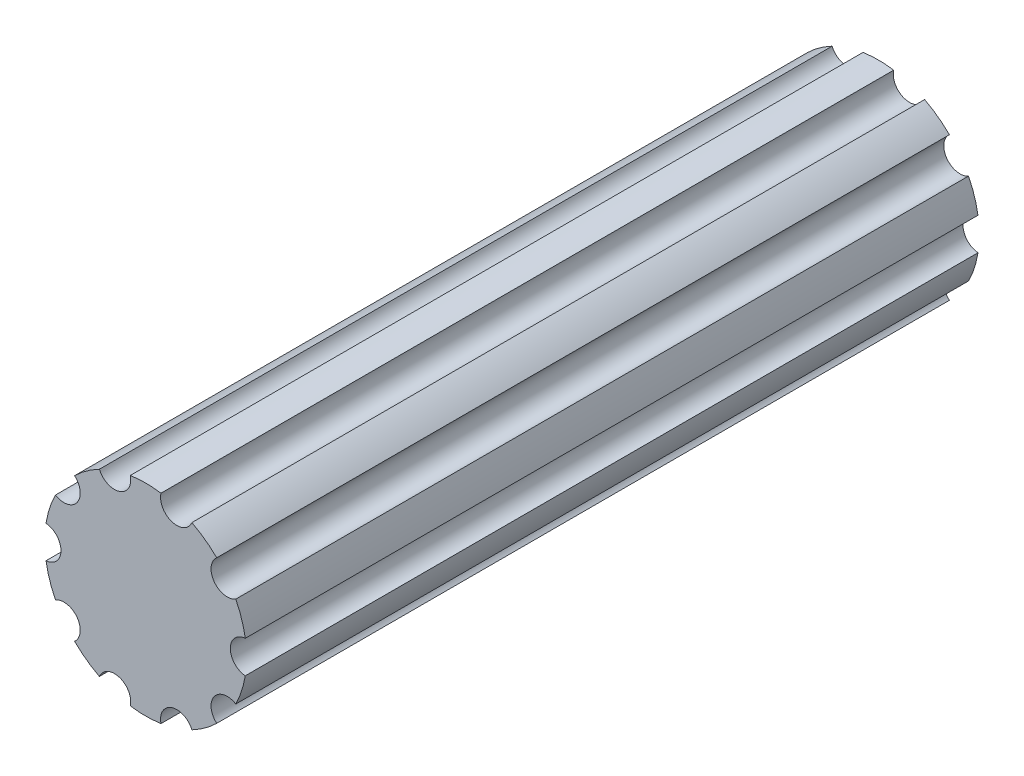
ISO-10303-21;
HEADER;
FILE_DESCRIPTION(('STEP AP214'),'2;1');
FILE_NAME('part.step','',(''),(''),'','','');
FILE_SCHEMA(('AUTOMOTIVE_DESIGN { 1 0 10303 214 1 1 1 1 }'));
ENDSEC;
DATA;
#1=APPLICATION_CONTEXT('core data for automotive mechanical design processes');
#2=APPLICATION_PROTOCOL_DEFINITION('international standard','automotive_design',2000,#1);
#3=PRODUCT_CONTEXT('',#1,'mechanical');
#4=PRODUCT('Part','Part','',(#3));
#5=PRODUCT_RELATED_PRODUCT_CATEGORY('part','',(#4));
#6=PRODUCT_DEFINITION_FORMATION('','',#4);
#7=PRODUCT_DEFINITION_CONTEXT('part definition',#1,'design');
#8=PRODUCT_DEFINITION('design','',#6,#7);
#9=PRODUCT_DEFINITION_SHAPE('','',#8);
#10=(LENGTH_UNIT() NAMED_UNIT(*) SI_UNIT(.MILLI.,.METRE.));
#11=(NAMED_UNIT(*) PLANE_ANGLE_UNIT() SI_UNIT($,.RADIAN.));
#12=(NAMED_UNIT(*) SI_UNIT($,.STERADIAN.) SOLID_ANGLE_UNIT());
#13=UNCERTAINTY_MEASURE_WITH_UNIT(LENGTH_MEASURE(1.E-05),#10,'distance_accuracy_value','');
#14=(GEOMETRIC_REPRESENTATION_CONTEXT(3) GLOBAL_UNCERTAINTY_ASSIGNED_CONTEXT((#13)) GLOBAL_UNIT_ASSIGNED_CONTEXT((#10,
#11,#12)) REPRESENTATION_CONTEXT('',''));
#15=CARTESIAN_POINT('',(0.,0.,0.));
#16=DIRECTION('',(0.,0.,1.));
#17=DIRECTION('',(1.,0.,0.));
#18=AXIS2_PLACEMENT_3D('',#15,#16,#17);
#19=CARTESIAN_POINT('',(0.,0.,5.715));
#20=DIRECTION('',(0.,0.,-1.));
#21=DIRECTION('',(-1.,0.,0.));
#22=AXIS2_PLACEMENT_3D('',#19,#20,#21);
#23=CYLINDRICAL_SURFACE('',#22,0.7874);
#24=CARTESIAN_POINT('',(0.,0.,0.));
#25=DIRECTION('',(0.,0.,1.));
#26=DIRECTION('',(1.,0.,0.));
#27=AXIS2_PLACEMENT_3D('',#24,#25,#26);
#28=CIRCLE('',#27,0.7874);
#29=CARTESIAN_POINT('',(0.703139668281363,-0.354391544607338,0.));
#30=VERTEX_POINT('',#29);
#31=CARTESIAN_POINT('',(0.77715806451613,-0.126586345067484,0.));
#32=VERTEX_POINT('',#31);
#33=EDGE_CURVE('E201',#30,#32,#28,.T.);
#34=ORIENTED_EDGE('',*,*,#33,.T.);
#35=DIRECTION('',(0.,0.,-1.));
#36=VECTOR('',#35,1.);
#37=CARTESIAN_POINT('',(0.77715806451613,-0.126586345067484,5.715));
#38=LINE('',#37,#36);
#39=CARTESIAN_POINT('',(0.77715806451613,-0.126586345067484,5.715));
#40=VERTEX_POINT('',#39);
#41=EDGE_CURVE('E11',#40,#32,#38,.T.);
#42=ORIENTED_EDGE('',*,*,#41,.F.);
#43=CARTESIAN_POINT('',(0.,0.,5.715));
#44=DIRECTION('',(0.,0.,1.));
#45=DIRECTION('',(1.,0.,0.));
#46=AXIS2_PLACEMENT_3D('',#43,#44,#45);
#47=CIRCLE('',#46,0.7874);
#48=CARTESIAN_POINT('',(0.703139668281363,-0.354391544607338,5.715));
#49=VERTEX_POINT('',#48);
#50=EDGE_CURVE('E239',#49,#40,#47,.T.);
#51=ORIENTED_EDGE('',*,*,#50,.F.);
#52=DIRECTION('',(0.,0.,-1.));
#53=VECTOR('',#52,1.);
#54=CARTESIAN_POINT('',(0.703139668281363,-0.354391544607338,5.715));
#55=LINE('',#54,#53);
#56=EDGE_CURVE('E197',#49,#30,#55,.T.);
#57=ORIENTED_EDGE('',*,*,#56,.T.);
#58=EDGE_LOOP('',(#34,#42,#51,#57));
#59=FACE_BOUND('',#58,.T.);
#60=ADVANCED_FACE('F33',(#59),#23,.T.);
#61=CARTESIAN_POINT('',(0.7874,0.,5.715));
#62=DIRECTION('',(0.,0.,-1.));
#63=DIRECTION('',(-1.,0.,0.));
#64=AXIS2_PLACEMENT_3D('',#61,#62,#63);
#65=CYLINDRICAL_SURFACE('',#64,0.127);
#66=CARTESIAN_POINT('',(0.7874,0.,0.));
#67=DIRECTION('',(0.,0.,-1.));
#68=DIRECTION('',(-1.,0.,0.));
#69=AXIS2_PLACEMENT_3D('',#66,#67,#68);
#70=CIRCLE('',#69,0.127);
#71=CARTESIAN_POINT('',(0.77715806451613,0.126586345067484,0.));
#72=VERTEX_POINT('',#71);
#73=EDGE_CURVE('E204',#32,#72,#70,.T.);
#74=ORIENTED_EDGE('',*,*,#73,.T.);
#75=DIRECTION('',(0.,0.,-1.));
#76=VECTOR('',#75,1.);
#77=CARTESIAN_POINT('',(0.77715806451613,0.126586345067484,5.715));
#78=LINE('',#77,#76);
#79=CARTESIAN_POINT('',(0.77715806451613,0.126586345067484,5.715));
#80=VERTEX_POINT('',#79);
#81=EDGE_CURVE('E41',#80,#72,#78,.T.);
#82=ORIENTED_EDGE('',*,*,#81,.F.);
#83=CARTESIAN_POINT('',(0.7874,0.,5.715));
#84=DIRECTION('',(0.,0.,-1.));
#85=DIRECTION('',(-1.,0.,0.));
#86=AXIS2_PLACEMENT_3D('',#83,#84,#85);
#87=CIRCLE('',#86,0.127);
#88=EDGE_CURVE('E128',#40,#80,#87,.T.);
#89=ORIENTED_EDGE('',*,*,#88,.F.);
#90=ORIENTED_EDGE('',*,*,#41,.T.);
#91=EDGE_LOOP('',(#74,#82,#89,#90));
#92=FACE_BOUND('',#91,.T.);
#93=ADVANCED_FACE('F357',(#92),#65,.F.);
#94=CARTESIAN_POINT('',(0.,0.,5.715));
#95=DIRECTION('',(0.,0.,-1.));
#96=DIRECTION('',(-1.,0.,0.));
#97=AXIS2_PLACEMENT_3D('',#94,#95,#96);
#98=CYLINDRICAL_SURFACE('',#97,0.7874);
#99=CARTESIAN_POINT('',(0.,0.,0.));
#100=DIRECTION('',(0.,0.,1.));
#101=DIRECTION('',(1.,0.,0.));
#102=AXIS2_PLACEMENT_3D('',#99,#100,#101);
#103=CIRCLE('',#102,0.7874);
#104=CARTESIAN_POINT('',(0.703139668281369,0.354391544607328,0.));
#105=VERTEX_POINT('',#104);
#106=EDGE_CURVE('E206',#72,#105,#103,.T.);
#107=ORIENTED_EDGE('',*,*,#106,.T.);
#108=DIRECTION('',(0.,0.,-1.));
#109=VECTOR('',#108,1.);
#110=CARTESIAN_POINT('',(0.703139668281369,0.354391544607328,5.715));
#111=LINE('',#110,#109);
#112=CARTESIAN_POINT('',(0.703139668281369,0.354391544607328,5.715));
#113=VERTEX_POINT('',#112);
#114=EDGE_CURVE('E282',#113,#105,#111,.T.);
#115=ORIENTED_EDGE('',*,*,#114,.F.);
#116=CARTESIAN_POINT('',(0.,0.,5.715));
#117=DIRECTION('',(0.,0.,1.));
#118=DIRECTION('',(1.,0.,0.));
#119=AXIS2_PLACEMENT_3D('',#116,#117,#118);
#120=CIRCLE('',#119,0.7874);
#121=EDGE_CURVE('E290',#80,#113,#120,.T.);
#122=ORIENTED_EDGE('',*,*,#121,.F.);
#123=ORIENTED_EDGE('',*,*,#81,.T.);
#124=EDGE_LOOP('',(#107,#115,#122,#123));
#125=FACE_BOUND('',#124,.T.);
#126=ADVANCED_FACE('F288',(#125),#98,.T.);
#127=CARTESIAN_POINT('',(0.63701998137084,0.462822107655085,5.715));
#128=DIRECTION('',(0.,0.,-1.));
#129=DIRECTION('',(-1.,0.,0.));
#130=AXIS2_PLACEMENT_3D('',#127,#128,#129);
#131=CYLINDRICAL_SURFACE('',#130,0.127);
#132=CARTESIAN_POINT('',(0.63701998137084,0.462822107655085,0.));
#133=DIRECTION('',(0.,0.,-1.));
#134=DIRECTION('',(-1.,0.,0.));
#135=AXIS2_PLACEMENT_3D('',#132,#133,#134);
#136=CIRCLE('',#135,0.127);
#137=CARTESIAN_POINT('',(0.554328494736824,0.559212553438142,0.));
#138=VERTEX_POINT('',#137);
#139=EDGE_CURVE('E208',#105,#138,#136,.T.);
#140=ORIENTED_EDGE('',*,*,#139,.T.);
#141=DIRECTION('',(0.,0.,-1.));
#142=VECTOR('',#141,1.);
#143=CARTESIAN_POINT('',(0.554328494736824,0.559212553438142,5.715));
#144=LINE('',#143,#142);
#145=CARTESIAN_POINT('',(0.554328494736824,0.559212553438142,5.715));
#146=VERTEX_POINT('',#145);
#147=EDGE_CURVE('E279',#146,#138,#144,.T.);
#148=ORIENTED_EDGE('',*,*,#147,.F.);
#149=CARTESIAN_POINT('',(0.63701998137084,0.462822107655085,5.715));
#150=DIRECTION('',(0.,0.,-1.));
#151=DIRECTION('',(-1.,0.,0.));
#152=AXIS2_PLACEMENT_3D('',#149,#150,#151);
#153=CIRCLE('',#152,0.127);
#154=EDGE_CURVE('E308',#113,#146,#153,.T.);
#155=ORIENTED_EDGE('',*,*,#154,.F.);
#156=ORIENTED_EDGE('',*,*,#114,.T.);
#157=EDGE_LOOP('',(#140,#148,#155,#156));
#158=FACE_BOUND('',#157,.T.);
#159=ADVANCED_FACE('F299',(#158),#131,.F.);
#160=CARTESIAN_POINT('',(0.,0.,5.715));
#161=DIRECTION('',(0.,0.,-1.));
#162=DIRECTION('',(-1.,0.,0.));
#163=AXIS2_PLACEMENT_3D('',#160,#161,#162);
#164=CYLINDRICAL_SURFACE('',#163,0.7874);
#165=CARTESIAN_POINT('',(0.,0.,0.));
#166=DIRECTION('',(0.,0.,1.));
#167=DIRECTION('',(1.,0.,0.));
#168=AXIS2_PLACEMENT_3D('',#165,#166,#167);
#169=CIRCLE('',#168,0.7874);
#170=CARTESIAN_POINT('',(0.360545817601451,0.700003909567726,0.));
#171=VERTEX_POINT('',#170);
#172=EDGE_CURVE('E210',#138,#171,#169,.T.);
#173=ORIENTED_EDGE('',*,*,#172,.T.);
#174=DIRECTION('',(0.,0.,-1.));
#175=VECTOR('',#174,1.);
#176=CARTESIAN_POINT('',(0.360545817601451,0.700003909567726,5.715));
#177=LINE('',#176,#175);
#178=CARTESIAN_POINT('',(0.360545817601451,0.700003909567726,5.715));
#179=VERTEX_POINT('',#178);
#180=EDGE_CURVE('E276',#179,#171,#177,.T.);
#181=ORIENTED_EDGE('',*,*,#180,.F.);
#182=CARTESIAN_POINT('',(0.,0.,5.715));
#183=DIRECTION('',(0.,0.,1.));
#184=DIRECTION('',(1.,0.,0.));
#185=AXIS2_PLACEMENT_3D('',#182,#183,#184);
#186=CIRCLE('',#185,0.7874);
#187=EDGE_CURVE('E305',#146,#179,#186,.T.);
#188=ORIENTED_EDGE('',*,*,#187,.F.);
#189=ORIENTED_EDGE('',*,*,#147,.T.);
#190=EDGE_LOOP('',(#173,#181,#188,#189));
#191=FACE_BOUND('',#190,.T.);
#192=ADVANCED_FACE('F303',(#191),#164,.T.);
#193=CARTESIAN_POINT('',(0.243319981370842,0.748861900930801,5.715));
#194=DIRECTION('',(0.,0.,-1.));
#195=DIRECTION('',(-1.,0.,0.));
#196=AXIS2_PLACEMENT_3D('',#193,#194,#195);
#197=CYLINDRICAL_SURFACE('',#196,0.127);
#198=CARTESIAN_POINT('',(0.243319981370842,0.748861900930801,0.));
#199=DIRECTION('',(0.,0.,-1.));
#200=DIRECTION('',(-1.,0.,0.));
#201=AXIS2_PLACEMENT_3D('',#198,#199,#200);
#202=CIRCLE('',#201,0.127);
#203=CARTESIAN_POINT('',(0.119764280900617,0.778238573331056,0.));
#204=VERTEX_POINT('',#203);
#205=EDGE_CURVE('E212',#171,#204,#202,.T.);
#206=ORIENTED_EDGE('',*,*,#205,.T.);
#207=DIRECTION('',(0.,0.,-1.));
#208=VECTOR('',#207,1.);
#209=CARTESIAN_POINT('',(0.119764280900617,0.778238573331056,5.715));
#210=LINE('',#209,#208);
#211=CARTESIAN_POINT('',(0.119764280900617,0.778238573331056,5.715));
#212=VERTEX_POINT('',#211);
#213=EDGE_CURVE('E273',#212,#204,#210,.T.);
#214=ORIENTED_EDGE('',*,*,#213,.F.);
#215=CARTESIAN_POINT('',(0.243319981370842,0.748861900930801,5.715));
#216=DIRECTION('',(0.,0.,-1.));
#217=DIRECTION('',(-1.,0.,0.));
#218=AXIS2_PLACEMENT_3D('',#215,#216,#217);
#219=CIRCLE('',#218,0.127);
#220=EDGE_CURVE('E307',#179,#212,#219,.T.);
#221=ORIENTED_EDGE('',*,*,#220,.F.);
#222=ORIENTED_EDGE('',*,*,#180,.T.);
#223=EDGE_LOOP('',(#206,#214,#221,#222));
#224=FACE_BOUND('',#223,.T.);
#225=ADVANCED_FACE('F370',(#224),#197,.F.);
#226=CARTESIAN_POINT('',(0.,0.,5.715));
#227=DIRECTION('',(0.,0.,-1.));
#228=DIRECTION('',(-1.,0.,0.));
#229=AXIS2_PLACEMENT_3D('',#226,#227,#228);
#230=CYLINDRICAL_SURFACE('',#229,0.7874);
#231=CARTESIAN_POINT('',(0.,0.,0.));
#232=DIRECTION('',(0.,0.,1.));
#233=DIRECTION('',(1.,0.,0.));
#234=AXIS2_PLACEMENT_3D('',#231,#232,#233);
#235=CIRCLE('',#234,0.7874);
#236=CARTESIAN_POINT('',(-0.1197642809006,0.778238573331059,0.));
#237=VERTEX_POINT('',#236);
#238=EDGE_CURVE('E214',#204,#237,#235,.T.);
#239=ORIENTED_EDGE('',*,*,#238,.T.);
#240=DIRECTION('',(0.,0.,-1.));
#241=VECTOR('',#240,1.);
#242=CARTESIAN_POINT('',(-0.1197642809006,0.778238573331059,5.715));
#243=LINE('',#242,#241);
#244=CARTESIAN_POINT('',(-0.1197642809006,0.778238573331059,5.715));
#245=VERTEX_POINT('',#244);
#246=EDGE_CURVE('E270',#245,#237,#243,.T.);
#247=ORIENTED_EDGE('',*,*,#246,.F.);
#248=CARTESIAN_POINT('',(0.,0.,5.715));
#249=DIRECTION('',(0.,0.,1.));
#250=DIRECTION('',(1.,0.,0.));
#251=AXIS2_PLACEMENT_3D('',#248,#249,#250);
#252=CIRCLE('',#251,0.7874);
#253=EDGE_CURVE('E310',#212,#245,#252,.T.);
#254=ORIENTED_EDGE('',*,*,#253,.F.);
#255=ORIENTED_EDGE('',*,*,#213,.T.);
#256=EDGE_LOOP('',(#239,#247,#254,#255));
#257=FACE_BOUND('',#256,.T.);
#258=ADVANCED_FACE('F373',(#257),#230,.T.);
#259=CARTESIAN_POINT('',(-0.243319981370826,0.748861900930806,5.715));
#260=DIRECTION('',(0.,0.,-1.));
#261=DIRECTION('',(-1.,0.,0.));
#262=AXIS2_PLACEMENT_3D('',#259,#260,#261);
#263=CYLINDRICAL_SURFACE('',#262,0.127);
#264=CARTESIAN_POINT('',(-0.243319981370826,0.748861900930806,0.));
#265=DIRECTION('',(0.,0.,-1.));
#266=DIRECTION('',(-1.,0.,0.));
#267=AXIS2_PLACEMENT_3D('',#264,#265,#266);
#268=CIRCLE('',#267,0.127);
#269=CARTESIAN_POINT('',(-0.360545817601437,0.700003909567733,0.));
#270=VERTEX_POINT('',#269);
#271=EDGE_CURVE('E216',#237,#270,#268,.T.);
#272=ORIENTED_EDGE('',*,*,#271,.T.);
#273=DIRECTION('',(0.,0.,-1.));
#274=VECTOR('',#273,1.);
#275=CARTESIAN_POINT('',(-0.360545817601437,0.700003909567733,5.715));
#276=LINE('',#275,#274);
#277=CARTESIAN_POINT('',(-0.360545817601437,0.700003909567733,5.715));
#278=VERTEX_POINT('',#277);
#279=EDGE_CURVE('E267',#278,#270,#276,.T.);
#280=ORIENTED_EDGE('',*,*,#279,.F.);
#281=CARTESIAN_POINT('',(-0.243319981370826,0.748861900930806,5.715));
#282=DIRECTION('',(0.,0.,-1.));
#283=DIRECTION('',(-1.,0.,0.));
#284=AXIS2_PLACEMENT_3D('',#281,#282,#283);
#285=CIRCLE('',#284,0.127);
#286=EDGE_CURVE('E316',#245,#278,#285,.T.);
#287=ORIENTED_EDGE('',*,*,#286,.F.);
#288=ORIENTED_EDGE('',*,*,#246,.T.);
#289=EDGE_LOOP('',(#272,#280,#287,#288));
#290=FACE_BOUND('',#289,.T.);
#291=ADVANCED_FACE('F377',(#290),#263,.F.);
#292=CARTESIAN_POINT('',(0.,0.,5.715));
#293=DIRECTION('',(0.,0.,-1.));
#294=DIRECTION('',(-1.,0.,0.));
#295=AXIS2_PLACEMENT_3D('',#292,#293,#294);
#296=CYLINDRICAL_SURFACE('',#295,0.7874);
#297=CARTESIAN_POINT('',(0.,0.,0.));
#298=DIRECTION('',(0.,0.,1.));
#299=DIRECTION('',(1.,0.,0.));
#300=AXIS2_PLACEMENT_3D('',#297,#298,#299);
#301=CIRCLE('',#300,0.7874);
#302=CARTESIAN_POINT('',(-0.554328494736812,0.559212553438154,0.));
#303=VERTEX_POINT('',#302);
#304=EDGE_CURVE('E218',#270,#303,#301,.T.);
#305=ORIENTED_EDGE('',*,*,#304,.T.);
#306=DIRECTION('',(0.,0.,-1.));
#307=VECTOR('',#306,1.);
#308=CARTESIAN_POINT('',(-0.554328494736812,0.559212553438154,5.715));
#309=LINE('',#308,#307);
#310=CARTESIAN_POINT('',(-0.554328494736812,0.559212553438154,5.715));
#311=VERTEX_POINT('',#310);
#312=EDGE_CURVE('E264',#311,#303,#309,.T.);
#313=ORIENTED_EDGE('',*,*,#312,.F.);
#314=CARTESIAN_POINT('',(0.,0.,5.715));
#315=DIRECTION('',(0.,0.,1.));
#316=DIRECTION('',(1.,0.,0.));
#317=AXIS2_PLACEMENT_3D('',#314,#315,#316);
#318=CIRCLE('',#317,0.7874);
#319=EDGE_CURVE('E318',#278,#311,#318,.T.);
#320=ORIENTED_EDGE('',*,*,#319,.F.);
#321=ORIENTED_EDGE('',*,*,#279,.T.);
#322=EDGE_LOOP('',(#305,#313,#320,#321));
#323=FACE_BOUND('',#322,.T.);
#324=ADVANCED_FACE('F381',(#323),#296,.T.);
#325=CARTESIAN_POINT('',(-0.637019981370829,0.462822107655099,5.715));
#326=DIRECTION('',(0.,0.,-1.));
#327=DIRECTION('',(-1.,0.,0.));
#328=AXIS2_PLACEMENT_3D('',#325,#326,#327);
#329=CYLINDRICAL_SURFACE('',#328,0.127);
#330=CARTESIAN_POINT('',(-0.637019981370829,0.462822107655099,0.));
#331=DIRECTION('',(0.,0.,-1.));
#332=DIRECTION('',(-1.,0.,0.));
#333=AXIS2_PLACEMENT_3D('',#330,#331,#332);
#334=CIRCLE('',#333,0.127);
#335=CARTESIAN_POINT('',(-0.70313966828136,0.354391544607343,0.));
#336=VERTEX_POINT('',#335);
#337=EDGE_CURVE('E220',#303,#336,#334,.T.);
#338=ORIENTED_EDGE('',*,*,#337,.T.);
#339=DIRECTION('',(0.,0.,-1.));
#340=VECTOR('',#339,1.);
#341=CARTESIAN_POINT('',(-0.70313966828136,0.354391544607343,5.715));
#342=LINE('',#341,#340);
#343=CARTESIAN_POINT('',(-0.70313966828136,0.354391544607343,5.715));
#344=VERTEX_POINT('',#343);
#345=EDGE_CURVE('E261',#344,#336,#342,.T.);
#346=ORIENTED_EDGE('',*,*,#345,.F.);
#347=CARTESIAN_POINT('',(-0.637019981370829,0.462822107655099,5.715));
#348=DIRECTION('',(0.,0.,-1.));
#349=DIRECTION('',(-1.,0.,0.));
#350=AXIS2_PLACEMENT_3D('',#347,#348,#349);
#351=CIRCLE('',#350,0.127);
#352=EDGE_CURVE('E320',#311,#344,#351,.T.);
#353=ORIENTED_EDGE('',*,*,#352,.F.);
#354=ORIENTED_EDGE('',*,*,#312,.T.);
#355=EDGE_LOOP('',(#338,#346,#353,#354));
#356=FACE_BOUND('',#355,.T.);
#357=ADVANCED_FACE('F385',(#356),#329,.F.);
#358=CARTESIAN_POINT('',(0.,0.,5.715));
#359=DIRECTION('',(0.,0.,-1.));
#360=DIRECTION('',(-1.,0.,0.));
#361=AXIS2_PLACEMENT_3D('',#358,#359,#360);
#362=CYLINDRICAL_SURFACE('',#361,0.787399999999999);
#363=CARTESIAN_POINT('',(0.,0.,0.));
#364=DIRECTION('',(0.,0.,1.));
#365=DIRECTION('',(1.,0.,0.));
#366=AXIS2_PLACEMENT_3D('',#363,#364,#365);
#367=CIRCLE('',#366,0.787399999999999);
#368=CARTESIAN_POINT('',(-0.777158064516128,0.126586345067484,0.));
#369=VERTEX_POINT('',#368);
#370=EDGE_CURVE('E222',#336,#369,#367,.T.);
#371=ORIENTED_EDGE('',*,*,#370,.T.);
#372=DIRECTION('',(0.,0.,-1.));
#373=VECTOR('',#372,1.);
#374=CARTESIAN_POINT('',(-0.777158064516128,0.126586345067484,5.715));
#375=LINE('',#374,#373);
#376=CARTESIAN_POINT('',(-0.777158064516128,0.126586345067484,5.715));
#377=VERTEX_POINT('',#376);
#378=EDGE_CURVE('E258',#377,#369,#375,.T.);
#379=ORIENTED_EDGE('',*,*,#378,.F.);
#380=CARTESIAN_POINT('',(0.,0.,5.715));
#381=DIRECTION('',(0.,0.,1.));
#382=DIRECTION('',(1.,0.,0.));
#383=AXIS2_PLACEMENT_3D('',#380,#381,#382);
#384=CIRCLE('',#383,0.787399999999999);
#385=EDGE_CURVE('E322',#344,#377,#384,.T.);
#386=ORIENTED_EDGE('',*,*,#385,.F.);
#387=ORIENTED_EDGE('',*,*,#345,.T.);
#388=EDGE_LOOP('',(#371,#379,#386,#387));
#389=FACE_BOUND('',#388,.T.);
#390=ADVANCED_FACE('F389',(#389),#362,.T.);
#391=CARTESIAN_POINT('',(-0.787399999999999,0.,5.715));
#392=DIRECTION('',(0.,0.,-1.));
#393=DIRECTION('',(-1.,0.,0.));
#394=AXIS2_PLACEMENT_3D('',#391,#392,#393);
#395=CYLINDRICAL_SURFACE('',#394,0.127);
#396=CARTESIAN_POINT('',(-0.787399999999999,0.,0.));
#397=DIRECTION('',(0.,0.,-1.));
#398=DIRECTION('',(-1.,0.,0.));
#399=AXIS2_PLACEMENT_3D('',#396,#397,#398);
#400=CIRCLE('',#399,0.127);
#401=CARTESIAN_POINT('',(-0.777158064516128,-0.126586345067484,0.));
#402=VERTEX_POINT('',#401);
#403=EDGE_CURVE('E224',#369,#402,#400,.T.);
#404=ORIENTED_EDGE('',*,*,#403,.T.);
#405=DIRECTION('',(0.,0.,-1.));
#406=VECTOR('',#405,1.);
#407=CARTESIAN_POINT('',(-0.777158064516128,-0.126586345067484,5.715));
#408=LINE('',#407,#406);
#409=CARTESIAN_POINT('',(-0.777158064516128,-0.126586345067484,5.715));
#410=VERTEX_POINT('',#409);
#411=EDGE_CURVE('E255',#410,#402,#408,.T.);
#412=ORIENTED_EDGE('',*,*,#411,.F.);
#413=CARTESIAN_POINT('',(-0.787399999999999,0.,5.715));
#414=DIRECTION('',(0.,0.,-1.));
#415=DIRECTION('',(-1.,0.,0.));
#416=AXIS2_PLACEMENT_3D('',#413,#414,#415);
#417=CIRCLE('',#416,0.127);
#418=EDGE_CURVE('E324',#377,#410,#417,.T.);
#419=ORIENTED_EDGE('',*,*,#418,.F.);
#420=ORIENTED_EDGE('',*,*,#378,.T.);
#421=EDGE_LOOP('',(#404,#412,#419,#420));
#422=FACE_BOUND('',#421,.T.);
#423=ADVANCED_FACE('F393',(#422),#395,.F.);
#424=CARTESIAN_POINT('',(0.,0.,5.715));
#425=DIRECTION('',(0.,0.,-1.));
#426=DIRECTION('',(-1.,0.,0.));
#427=AXIS2_PLACEMENT_3D('',#424,#425,#426);
#428=CYLINDRICAL_SURFACE('',#427,0.787399999999999);
#429=CARTESIAN_POINT('',(0.,0.,0.));
#430=DIRECTION('',(0.,0.,1.));
#431=DIRECTION('',(1.,0.,0.));
#432=AXIS2_PLACEMENT_3D('',#429,#430,#431);
#433=CIRCLE('',#432,0.787399999999999);
#434=CARTESIAN_POINT('',(-0.703139668281365,-0.354391544607332,0.));
#435=VERTEX_POINT('',#434);
#436=EDGE_CURVE('E226',#402,#435,#433,.T.);
#437=ORIENTED_EDGE('',*,*,#436,.T.);
#438=DIRECTION('',(0.,0.,-1.));
#439=VECTOR('',#438,1.);
#440=CARTESIAN_POINT('',(-0.703139668281365,-0.354391544607332,5.715));
#441=LINE('',#440,#439);
#442=CARTESIAN_POINT('',(-0.703139668281365,-0.354391544607332,5.715));
#443=VERTEX_POINT('',#442);
#444=EDGE_CURVE('E252',#443,#435,#441,.T.);
#445=ORIENTED_EDGE('',*,*,#444,.F.);
#446=CARTESIAN_POINT('',(0.,0.,5.715));
#447=DIRECTION('',(0.,0.,1.));
#448=DIRECTION('',(1.,0.,0.));
#449=AXIS2_PLACEMENT_3D('',#446,#447,#448);
#450=CIRCLE('',#449,0.787399999999999);
#451=EDGE_CURVE('E326',#410,#443,#450,.T.);
#452=ORIENTED_EDGE('',*,*,#451,.F.);
#453=ORIENTED_EDGE('',*,*,#411,.T.);
#454=EDGE_LOOP('',(#437,#445,#452,#453));
#455=FACE_BOUND('',#454,.T.);
#456=ADVANCED_FACE('F397',(#455),#428,.T.);
#457=CARTESIAN_POINT('',(-0.637019981370836,-0.462822107655089,5.715));
#458=DIRECTION('',(0.,0.,-1.));
#459=DIRECTION('',(-1.,0.,0.));
#460=AXIS2_PLACEMENT_3D('',#457,#458,#459);
#461=CYLINDRICAL_SURFACE('',#460,0.127);
#462=CARTESIAN_POINT('',(-0.637019981370836,-0.462822107655089,0.));
#463=DIRECTION('',(0.,0.,-1.));
#464=DIRECTION('',(-1.,0.,0.));
#465=AXIS2_PLACEMENT_3D('',#462,#463,#464);
#466=CIRCLE('',#465,0.127);
#467=CARTESIAN_POINT('',(-0.55432849473682,-0.559212553438146,0.));
#468=VERTEX_POINT('',#467);
#469=EDGE_CURVE('E228',#435,#468,#466,.T.);
#470=ORIENTED_EDGE('',*,*,#469,.T.);
#471=DIRECTION('',(0.,0.,-1.));
#472=VECTOR('',#471,1.);
#473=CARTESIAN_POINT('',(-0.55432849473682,-0.559212553438146,5.715));
#474=LINE('',#473,#472);
#475=CARTESIAN_POINT('',(-0.55432849473682,-0.559212553438146,5.715));
#476=VERTEX_POINT('',#475);
#477=EDGE_CURVE('E249',#476,#468,#474,.T.);
#478=ORIENTED_EDGE('',*,*,#477,.F.);
#479=CARTESIAN_POINT('',(-0.637019981370836,-0.462822107655089,5.715));
#480=DIRECTION('',(0.,0.,-1.));
#481=DIRECTION('',(-1.,0.,0.));
#482=AXIS2_PLACEMENT_3D('',#479,#480,#481);
#483=CIRCLE('',#482,0.127);
#484=EDGE_CURVE('E328',#443,#476,#483,.T.);
#485=ORIENTED_EDGE('',*,*,#484,.F.);
#486=ORIENTED_EDGE('',*,*,#444,.T.);
#487=EDGE_LOOP('',(#470,#478,#485,#486));
#488=FACE_BOUND('',#487,.T.);
#489=ADVANCED_FACE('F401',(#488),#461,.F.);
#490=CARTESIAN_POINT('',(0.,0.,5.715));
#491=DIRECTION('',(0.,0.,-1.));
#492=DIRECTION('',(-1.,0.,0.));
#493=AXIS2_PLACEMENT_3D('',#490,#491,#492);
#494=CYLINDRICAL_SURFACE('',#493,0.7874);
#495=CARTESIAN_POINT('',(0.,0.,0.));
#496=DIRECTION('',(0.,0.,1.));
#497=DIRECTION('',(1.,0.,0.));
#498=AXIS2_PLACEMENT_3D('',#495,#496,#497);
#499=CIRCLE('',#498,0.7874);
#500=CARTESIAN_POINT('',(-0.360545817601446,-0.700003909567728,0.));
#501=VERTEX_POINT('',#500);
#502=EDGE_CURVE('E230',#468,#501,#499,.T.);
#503=ORIENTED_EDGE('',*,*,#502,.T.);
#504=DIRECTION('',(0.,0.,-1.));
#505=VECTOR('',#504,1.);
#506=CARTESIAN_POINT('',(-0.360545817601446,-0.700003909567728,5.715));
#507=LINE('',#506,#505);
#508=CARTESIAN_POINT('',(-0.360545817601446,-0.700003909567728,5.715));
#509=VERTEX_POINT('',#508);
#510=EDGE_CURVE('E246',#509,#501,#507,.T.);
#511=ORIENTED_EDGE('',*,*,#510,.F.);
#512=CARTESIAN_POINT('',(0.,0.,5.715));
#513=DIRECTION('',(0.,0.,1.));
#514=DIRECTION('',(1.,0.,0.));
#515=AXIS2_PLACEMENT_3D('',#512,#513,#514);
#516=CIRCLE('',#515,0.7874);
#517=EDGE_CURVE('E330',#476,#509,#516,.T.);
#518=ORIENTED_EDGE('',*,*,#517,.F.);
#519=ORIENTED_EDGE('',*,*,#477,.T.);
#520=EDGE_LOOP('',(#503,#511,#518,#519));
#521=FACE_BOUND('',#520,.T.);
#522=ADVANCED_FACE('F405',(#521),#494,.T.);
#523=CARTESIAN_POINT('',(-0.243319981370837,-0.748861900930803,5.715));
#524=DIRECTION('',(0.,0.,-1.));
#525=DIRECTION('',(-1.,0.,0.));
#526=AXIS2_PLACEMENT_3D('',#523,#524,#525);
#527=CYLINDRICAL_SURFACE('',#526,0.127);
#528=CARTESIAN_POINT('',(-0.243319981370837,-0.748861900930803,0.));
#529=DIRECTION('',(0.,0.,-1.));
#530=DIRECTION('',(-1.,0.,0.));
#531=AXIS2_PLACEMENT_3D('',#528,#529,#530);
#532=CIRCLE('',#531,0.127);
#533=CARTESIAN_POINT('',(-0.119764280900611,-0.778238573331057,0.));
#534=VERTEX_POINT('',#533);
#535=EDGE_CURVE('E232',#501,#534,#532,.T.);
#536=ORIENTED_EDGE('',*,*,#535,.T.);
#537=DIRECTION('',(0.,0.,-1.));
#538=VECTOR('',#537,1.);
#539=CARTESIAN_POINT('',(-0.119764280900611,-0.778238573331057,5.715));
#540=LINE('',#539,#538);
#541=CARTESIAN_POINT('',(-0.119764280900611,-0.778238573331057,5.715));
#542=VERTEX_POINT('',#541);
#543=EDGE_CURVE('E243',#542,#534,#540,.T.);
#544=ORIENTED_EDGE('',*,*,#543,.F.);
#545=CARTESIAN_POINT('',(-0.243319981370837,-0.748861900930803,5.715));
#546=DIRECTION('',(0.,0.,-1.));
#547=DIRECTION('',(-1.,0.,0.));
#548=AXIS2_PLACEMENT_3D('',#545,#546,#547);
#549=CIRCLE('',#548,0.127);
#550=EDGE_CURVE('E332',#509,#542,#549,.T.);
#551=ORIENTED_EDGE('',*,*,#550,.F.);
#552=ORIENTED_EDGE('',*,*,#510,.T.);
#553=EDGE_LOOP('',(#536,#544,#551,#552));
#554=FACE_BOUND('',#553,.T.);
#555=ADVANCED_FACE('F338',(#554),#527,.F.);
#556=CARTESIAN_POINT('',(0.,0.,5.715));
#557=DIRECTION('',(0.,0.,-1.));
#558=DIRECTION('',(-1.,0.,0.));
#559=AXIS2_PLACEMENT_3D('',#556,#557,#558);
#560=CYLINDRICAL_SURFACE('',#559,0.7874);
#561=CARTESIAN_POINT('',(0.,0.,0.));
#562=DIRECTION('',(0.,0.,1.));
#563=DIRECTION('',(1.,0.,0.));
#564=AXIS2_PLACEMENT_3D('',#561,#562,#563);
#565=CIRCLE('',#564,0.7874);
#566=CARTESIAN_POINT('',(0.119764280900606,-0.778238573331058,0.));
#567=VERTEX_POINT('',#566);
#568=EDGE_CURVE('E234',#534,#567,#565,.T.);
#569=ORIENTED_EDGE('',*,*,#568,.T.);
#570=DIRECTION('',(0.,0.,-1.));
#571=VECTOR('',#570,1.);
#572=CARTESIAN_POINT('',(0.119764280900606,-0.778238573331058,5.715));
#573=LINE('',#572,#571);
#574=CARTESIAN_POINT('',(0.119764280900606,-0.778238573331058,5.715));
#575=VERTEX_POINT('',#574);
#576=EDGE_CURVE('E192',#575,#567,#573,.T.);
#577=ORIENTED_EDGE('',*,*,#576,.F.);
#578=CARTESIAN_POINT('',(0.,0.,5.715));
#579=DIRECTION('',(0.,0.,1.));
#580=DIRECTION('',(1.,0.,0.));
#581=AXIS2_PLACEMENT_3D('',#578,#579,#580);
#582=CIRCLE('',#581,0.7874);
#583=EDGE_CURVE('E183',#542,#575,#582,.T.);
#584=ORIENTED_EDGE('',*,*,#583,.F.);
#585=ORIENTED_EDGE('',*,*,#543,.T.);
#586=EDGE_LOOP('',(#569,#577,#584,#585));
#587=FACE_BOUND('',#586,.T.);
#588=ADVANCED_FACE('F342',(#587),#560,.T.);
#589=CARTESIAN_POINT('',(0.243319981370831,-0.748861900930805,5.715));
#590=DIRECTION('',(0.,0.,-1.));
#591=DIRECTION('',(-1.,0.,0.));
#592=AXIS2_PLACEMENT_3D('',#589,#590,#591);
#593=CYLINDRICAL_SURFACE('',#592,0.127);
#594=CARTESIAN_POINT('',(0.243319981370831,-0.748861900930805,0.));
#595=DIRECTION('',(0.,0.,-1.));
#596=DIRECTION('',(-1.,0.,0.));
#597=AXIS2_PLACEMENT_3D('',#594,#595,#596);
#598=CIRCLE('',#597,0.127);
#599=CARTESIAN_POINT('',(0.360545817601441,-0.700003909567731,0.));
#600=VERTEX_POINT('',#599);
#601=EDGE_CURVE('E191',#567,#600,#598,.T.);
#602=ORIENTED_EDGE('',*,*,#601,.T.);
#603=DIRECTION('',(0.,0.,-1.));
#604=VECTOR('',#603,1.);
#605=CARTESIAN_POINT('',(0.360545817601441,-0.700003909567731,5.715));
#606=LINE('',#605,#604);
#607=CARTESIAN_POINT('',(0.360545817601441,-0.700003909567731,5.715));
#608=VERTEX_POINT('',#607);
#609=EDGE_CURVE('E188',#608,#600,#606,.T.);
#610=ORIENTED_EDGE('',*,*,#609,.F.);
#611=CARTESIAN_POINT('',(0.243319981370831,-0.748861900930805,5.715));
#612=DIRECTION('',(0.,0.,-1.));
#613=DIRECTION('',(-1.,0.,0.));
#614=AXIS2_PLACEMENT_3D('',#611,#612,#613);
#615=CIRCLE('',#614,0.127);
#616=EDGE_CURVE('E177',#575,#608,#615,.T.);
#617=ORIENTED_EDGE('',*,*,#616,.F.);
#618=ORIENTED_EDGE('',*,*,#576,.T.);
#619=EDGE_LOOP('',(#602,#610,#617,#618));
#620=FACE_BOUND('',#619,.T.);
#621=ADVANCED_FACE('F189',(#620),#593,.F.);
#622=CARTESIAN_POINT('',(0.,0.,5.715));
#623=DIRECTION('',(0.,0.,-1.));
#624=DIRECTION('',(-1.,0.,0.));
#625=AXIS2_PLACEMENT_3D('',#622,#623,#624);
#626=CYLINDRICAL_SURFACE('',#625,0.7874);
#627=CARTESIAN_POINT('',(0.,0.,0.));
#628=DIRECTION('',(0.,0.,1.));
#629=DIRECTION('',(1.,0.,0.));
#630=AXIS2_PLACEMENT_3D('',#627,#628,#629);
#631=CIRCLE('',#630,0.7874);
#632=CARTESIAN_POINT('',(0.554328494736816,-0.55921255343815,0.));
#633=VERTEX_POINT('',#632);
#634=EDGE_CURVE('E114',#600,#633,#631,.T.);
#635=ORIENTED_EDGE('',*,*,#634,.T.);
#636=DIRECTION('',(0.,0.,-1.));
#637=VECTOR('',#636,1.);
#638=CARTESIAN_POINT('',(0.554328494736816,-0.55921255343815,5.715));
#639=LINE('',#638,#637);
#640=CARTESIAN_POINT('',(0.554328494736816,-0.55921255343815,5.715));
#641=VERTEX_POINT('',#640);
#642=EDGE_CURVE('E193',#641,#633,#639,.T.);
#643=ORIENTED_EDGE('',*,*,#642,.F.);
#644=CARTESIAN_POINT('',(0.,0.,5.715));
#645=DIRECTION('',(0.,0.,1.));
#646=DIRECTION('',(1.,0.,0.));
#647=AXIS2_PLACEMENT_3D('',#644,#645,#646);
#648=CIRCLE('',#647,0.7874);
#649=EDGE_CURVE('E181',#608,#641,#648,.T.);
#650=ORIENTED_EDGE('',*,*,#649,.F.);
#651=ORIENTED_EDGE('',*,*,#609,.T.);
#652=EDGE_LOOP('',(#635,#643,#650,#651));
#653=FACE_BOUND('',#652,.T.);
#654=ADVANCED_FACE('F195',(#653),#626,.T.);
#655=CARTESIAN_POINT('',(0.637019981370833,-0.462822107655094,5.715));
#656=DIRECTION('',(0.,0.,-1.));
#657=DIRECTION('',(-1.,0.,0.));
#658=AXIS2_PLACEMENT_3D('',#655,#656,#657);
#659=CYLINDRICAL_SURFACE('',#658,0.127);
#660=CARTESIAN_POINT('',(0.637019981370833,-0.462822107655094,0.));
#661=DIRECTION('',(0.,0.,-1.));
#662=DIRECTION('',(-1.,0.,0.));
#663=AXIS2_PLACEMENT_3D('',#660,#661,#662);
#664=CIRCLE('',#663,0.127);
#665=EDGE_CURVE('E120',#633,#30,#664,.T.);
#666=ORIENTED_EDGE('',*,*,#665,.T.);
#667=ORIENTED_EDGE('',*,*,#56,.F.);
#668=CARTESIAN_POINT('',(0.637019981370833,-0.462822107655094,5.715));
#669=DIRECTION('',(0.,0.,-1.));
#670=DIRECTION('',(-1.,0.,0.));
#671=AXIS2_PLACEMENT_3D('',#668,#669,#670);
#672=CIRCLE('',#671,0.127);
#673=EDGE_CURVE('E49',#641,#49,#672,.T.);
#674=ORIENTED_EDGE('',*,*,#673,.F.);
#675=ORIENTED_EDGE('',*,*,#642,.T.);
#676=EDGE_LOOP('',(#666,#667,#674,#675));
#677=FACE_BOUND('',#676,.T.);
#678=ADVANCED_FACE('F346',(#677),#659,.F.);
#679=CARTESIAN_POINT('',(0.3937,0.,5.715));
#680=DIRECTION('',(0.,0.,1.));
#681=DIRECTION('',(1.,0.,0.));
#682=AXIS2_PLACEMENT_3D('',#679,#680,#681);
#683=PLANE('',#682);
#684=ORIENTED_EDGE('',*,*,#50,.T.);
#685=ORIENTED_EDGE('',*,*,#88,.T.);
#686=ORIENTED_EDGE('',*,*,#121,.T.);
#687=ORIENTED_EDGE('',*,*,#154,.T.);
#688=ORIENTED_EDGE('',*,*,#187,.T.);
#689=ORIENTED_EDGE('',*,*,#220,.T.);
#690=ORIENTED_EDGE('',*,*,#253,.T.);
#691=ORIENTED_EDGE('',*,*,#286,.T.);
#692=ORIENTED_EDGE('',*,*,#319,.T.);
#693=ORIENTED_EDGE('',*,*,#352,.T.);
#694=ORIENTED_EDGE('',*,*,#385,.T.);
#695=ORIENTED_EDGE('',*,*,#418,.T.);
#696=ORIENTED_EDGE('',*,*,#451,.T.);
#697=ORIENTED_EDGE('',*,*,#484,.T.);
#698=ORIENTED_EDGE('',*,*,#517,.T.);
#699=ORIENTED_EDGE('',*,*,#550,.T.);
#700=ORIENTED_EDGE('',*,*,#583,.T.);
#701=ORIENTED_EDGE('',*,*,#616,.T.);
#702=ORIENTED_EDGE('',*,*,#649,.T.);
#703=ORIENTED_EDGE('',*,*,#673,.T.);
#704=EDGE_LOOP('',(#684,#685,#686,#687,#688,#689,#690,#691,#692,#693,#694,#695,#696,#697,#698,
#699,#700,#701,#702,#703));
#705=FACE_BOUND('',#704,.T.);
#706=ADVANCED_FACE('F179',(#705),#683,.T.);
#707=CARTESIAN_POINT('',(0.3937,0.,0.));
#708=DIRECTION('',(0.,0.,1.));
#709=DIRECTION('',(1.,0.,0.));
#710=AXIS2_PLACEMENT_3D('',#707,#708,#709);
#711=PLANE('',#710);
#712=ORIENTED_EDGE('',*,*,#33,.F.);
#713=ORIENTED_EDGE('',*,*,#665,.F.);
#714=ORIENTED_EDGE('',*,*,#634,.F.);
#715=ORIENTED_EDGE('',*,*,#601,.F.);
#716=ORIENTED_EDGE('',*,*,#568,.F.);
#717=ORIENTED_EDGE('',*,*,#535,.F.);
#718=ORIENTED_EDGE('',*,*,#502,.F.);
#719=ORIENTED_EDGE('',*,*,#469,.F.);
#720=ORIENTED_EDGE('',*,*,#436,.F.);
#721=ORIENTED_EDGE('',*,*,#403,.F.);
#722=ORIENTED_EDGE('',*,*,#370,.F.);
#723=ORIENTED_EDGE('',*,*,#337,.F.);
#724=ORIENTED_EDGE('',*,*,#304,.F.);
#725=ORIENTED_EDGE('',*,*,#271,.F.);
#726=ORIENTED_EDGE('',*,*,#238,.F.);
#727=ORIENTED_EDGE('',*,*,#205,.F.);
#728=ORIENTED_EDGE('',*,*,#172,.F.);
#729=ORIENTED_EDGE('',*,*,#139,.F.);
#730=ORIENTED_EDGE('',*,*,#106,.F.);
#731=ORIENTED_EDGE('',*,*,#73,.F.);
#732=EDGE_LOOP('',(#712,#713,#714,#715,#716,#717,#718,#719,#720,#721,#722,#723,#724,#725,#726,
#727,#728,#729,#730,#731));
#733=FACE_BOUND('',#732,.T.);
#734=ADVANCED_FACE('F294',(#733),#711,.F.);
#735=CLOSED_SHELL('',(#60,#93,#126,#159,#192,#225,#258,#291,#324,#357,#390,#423,#456,#489,#522,
#555,#588,#621,#654,#678,#706,#734));
#736=MANIFOLD_SOLID_BREP('B2',#735);
#737=ADVANCED_BREP_SHAPE_REPRESENTATION('',(#18,#736),#14);
#738=SHAPE_DEFINITION_REPRESENTATION(#9,#737);
ENDSEC;
END-ISO-10303-21;
